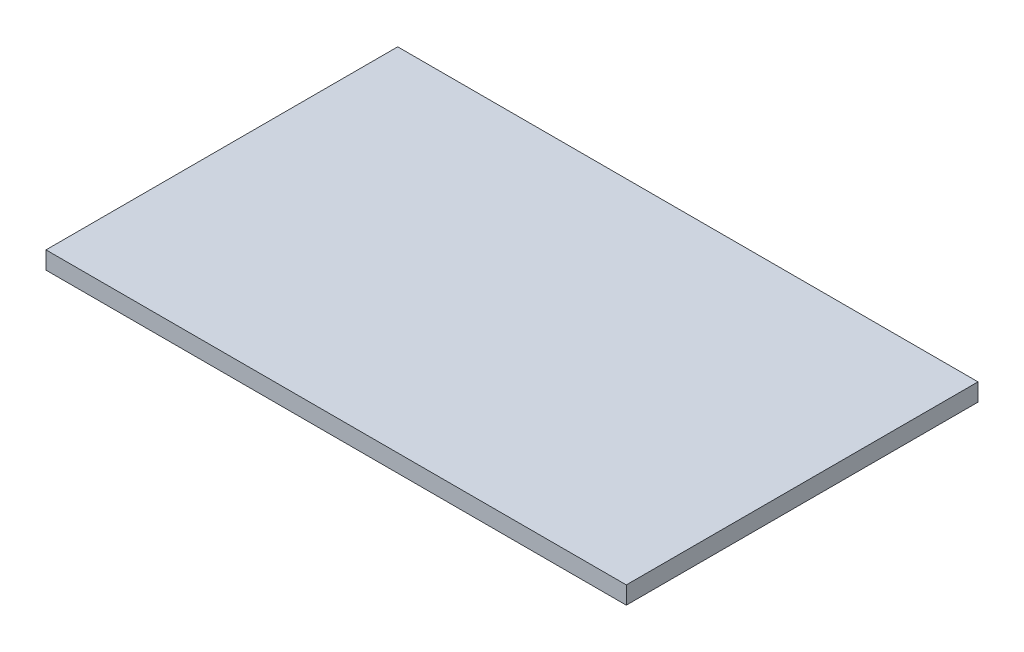
ISO-10303-21;
HEADER;
FILE_DESCRIPTION(('STEP AP214'),'2;1');
FILE_NAME('part.step','',(''),(''),'','','');
FILE_SCHEMA(('AUTOMOTIVE_DESIGN { 1 0 10303 214 1 1 1 1 }'));
ENDSEC;
DATA;
#1=APPLICATION_CONTEXT('core data for automotive mechanical design processes');
#2=APPLICATION_PROTOCOL_DEFINITION('international standard','automotive_design',2000,#1);
#3=PRODUCT_CONTEXT('',#1,'mechanical');
#4=PRODUCT('Part','Part','',(#3));
#5=PRODUCT_RELATED_PRODUCT_CATEGORY('part','',(#4));
#6=PRODUCT_DEFINITION_FORMATION('','',#4);
#7=PRODUCT_DEFINITION_CONTEXT('part definition',#1,'design');
#8=PRODUCT_DEFINITION('design','',#6,#7);
#9=PRODUCT_DEFINITION_SHAPE('','',#8);
#10=(LENGTH_UNIT() NAMED_UNIT(*) SI_UNIT(.MILLI.,.METRE.));
#11=(NAMED_UNIT(*) PLANE_ANGLE_UNIT() SI_UNIT($,.RADIAN.));
#12=(NAMED_UNIT(*) SI_UNIT($,.STERADIAN.) SOLID_ANGLE_UNIT());
#13=UNCERTAINTY_MEASURE_WITH_UNIT(LENGTH_MEASURE(1.E-05),#10,'distance_accuracy_value','');
#14=(GEOMETRIC_REPRESENTATION_CONTEXT(3) GLOBAL_UNCERTAINTY_ASSIGNED_CONTEXT((#13)) GLOBAL_UNIT_ASSIGNED_CONTEXT((#10,
#11,#12)) REPRESENTATION_CONTEXT('',''));
#15=CARTESIAN_POINT('',(0.,0.,0.));
#16=DIRECTION('',(0.,0.,1.));
#17=DIRECTION('',(1.,0.,0.));
#18=AXIS2_PLACEMENT_3D('',#15,#16,#17);
#19=CARTESIAN_POINT('',(-1.65,0.1,1.));
#20=DIRECTION('',(1.,0.,0.));
#21=DIRECTION('',(0.,0.,-1.));
#22=AXIS2_PLACEMENT_3D('',#19,#20,#21);
#23=PLANE('',#22);
#24=DIRECTION('',(0.,0.,1.));
#25=VECTOR('',#24,1.);
#26=CARTESIAN_POINT('',(-1.65,0.,1.));
#27=LINE('',#26,#25);
#28=CARTESIAN_POINT('',(-1.65,0.,-1.));
#29=VERTEX_POINT('',#28);
#30=CARTESIAN_POINT('',(-1.65,0.,1.));
#31=VERTEX_POINT('',#30);
#32=EDGE_CURVE('E98',#29,#31,#27,.T.);
#33=ORIENTED_EDGE('',*,*,#32,.T.);
#34=DIRECTION('',(0.,-1.,0.));
#35=VECTOR('',#34,1.);
#36=CARTESIAN_POINT('',(-1.65,0.1,1.));
#37=LINE('',#36,#35);
#38=CARTESIAN_POINT('',(-1.65,0.1,1.));
#39=VERTEX_POINT('',#38);
#40=EDGE_CURVE('E11',#39,#31,#37,.T.);
#41=ORIENTED_EDGE('',*,*,#40,.F.);
#42=DIRECTION('',(0.,0.,1.));
#43=VECTOR('',#42,1.);
#44=CARTESIAN_POINT('',(-1.65,0.1,1.));
#45=LINE('',#44,#43);
#46=CARTESIAN_POINT('',(-1.65,0.1,-1.));
#47=VERTEX_POINT('',#46);
#48=EDGE_CURVE('E86',#47,#39,#45,.T.);
#49=ORIENTED_EDGE('',*,*,#48,.F.);
#50=DIRECTION('',(0.,-1.,0.));
#51=VECTOR('',#50,1.);
#52=CARTESIAN_POINT('',(-1.65,0.1,-1.));
#53=LINE('',#52,#51);
#54=EDGE_CURVE('E94',#47,#29,#53,.T.);
#55=ORIENTED_EDGE('',*,*,#54,.T.);
#56=EDGE_LOOP('',(#33,#41,#49,#55));
#57=FACE_BOUND('',#56,.T.);
#58=ADVANCED_FACE('F35',(#57),#23,.F.);
#59=CARTESIAN_POINT('',(1.65,0.1,1.));
#60=DIRECTION('',(0.,0.,-1.));
#61=DIRECTION('',(-1.,0.,0.));
#62=AXIS2_PLACEMENT_3D('',#59,#60,#61);
#63=PLANE('',#62);
#64=DIRECTION('',(1.,0.,0.));
#65=VECTOR('',#64,1.);
#66=CARTESIAN_POINT('',(1.65,0.,1.));
#67=LINE('',#66,#65);
#68=CARTESIAN_POINT('',(1.65,0.,1.));
#69=VERTEX_POINT('',#68);
#70=EDGE_CURVE('E90',#31,#69,#67,.T.);
#71=ORIENTED_EDGE('',*,*,#70,.T.);
#72=DIRECTION('',(0.,-1.,0.));
#73=VECTOR('',#72,1.);
#74=CARTESIAN_POINT('',(1.65,0.1,1.));
#75=LINE('',#74,#73);
#76=CARTESIAN_POINT('',(1.65,0.1,1.));
#77=VERTEX_POINT('',#76);
#78=EDGE_CURVE('E43',#77,#69,#75,.T.);
#79=ORIENTED_EDGE('',*,*,#78,.F.);
#80=DIRECTION('',(1.,0.,0.));
#81=VECTOR('',#80,1.);
#82=CARTESIAN_POINT('',(1.65,0.1,1.));
#83=LINE('',#82,#81);
#84=EDGE_CURVE('E81',#39,#77,#83,.T.);
#85=ORIENTED_EDGE('',*,*,#84,.F.);
#86=ORIENTED_EDGE('',*,*,#40,.T.);
#87=EDGE_LOOP('',(#71,#79,#85,#86));
#88=FACE_BOUND('',#87,.T.);
#89=ADVANCED_FACE('F89',(#88),#63,.F.);
#90=CARTESIAN_POINT('',(1.65,0.1,1.));
#91=DIRECTION('',(-1.,0.,0.));
#92=DIRECTION('',(0.,0.,1.));
#93=AXIS2_PLACEMENT_3D('',#90,#91,#92);
#94=PLANE('',#93);
#95=DIRECTION('',(0.,0.,-1.));
#96=VECTOR('',#95,1.);
#97=CARTESIAN_POINT('',(1.65,0.,1.));
#98=LINE('',#97,#96);
#99=CARTESIAN_POINT('',(1.65,0.,-1.));
#100=VERTEX_POINT('',#99);
#101=EDGE_CURVE('E68',#69,#100,#98,.T.);
#102=ORIENTED_EDGE('',*,*,#101,.T.);
#103=DIRECTION('',(0.,-1.,0.));
#104=VECTOR('',#103,1.);
#105=CARTESIAN_POINT('',(1.65,0.1,-1.));
#106=LINE('',#105,#104);
#107=CARTESIAN_POINT('',(1.65,0.1,-1.));
#108=VERTEX_POINT('',#107);
#109=EDGE_CURVE('E91',#108,#100,#106,.T.);
#110=ORIENTED_EDGE('',*,*,#109,.F.);
#111=DIRECTION('',(0.,0.,-1.));
#112=VECTOR('',#111,1.);
#113=CARTESIAN_POINT('',(1.65,0.1,1.));
#114=LINE('',#113,#112);
#115=EDGE_CURVE('E84',#77,#108,#114,.T.);
#116=ORIENTED_EDGE('',*,*,#115,.F.);
#117=ORIENTED_EDGE('',*,*,#78,.T.);
#118=EDGE_LOOP('',(#102,#110,#116,#117));
#119=FACE_BOUND('',#118,.T.);
#120=ADVANCED_FACE('F92',(#119),#94,.F.);
#121=CARTESIAN_POINT('',(1.65,0.1,-1.));
#122=DIRECTION('',(0.,0.,1.));
#123=DIRECTION('',(1.,0.,0.));
#124=AXIS2_PLACEMENT_3D('',#121,#122,#123);
#125=PLANE('',#124);
#126=DIRECTION('',(-1.,0.,0.));
#127=VECTOR('',#126,1.);
#128=CARTESIAN_POINT('',(1.65,0.,-1.));
#129=LINE('',#128,#127);
#130=EDGE_CURVE('E74',#100,#29,#129,.T.);
#131=ORIENTED_EDGE('',*,*,#130,.T.);
#132=ORIENTED_EDGE('',*,*,#54,.F.);
#133=DIRECTION('',(-1.,0.,0.));
#134=VECTOR('',#133,1.);
#135=CARTESIAN_POINT('',(1.65,0.1,-1.));
#136=LINE('',#135,#134);
#137=EDGE_CURVE('E51',#108,#47,#136,.T.);
#138=ORIENTED_EDGE('',*,*,#137,.F.);
#139=ORIENTED_EDGE('',*,*,#109,.T.);
#140=EDGE_LOOP('',(#131,#132,#138,#139));
#141=FACE_BOUND('',#140,.T.);
#142=ADVANCED_FACE('F105',(#141),#125,.F.);
#143=CARTESIAN_POINT('',(0.,0.1,0.));
#144=DIRECTION('',(0.,1.,0.));
#145=DIRECTION('',(0.,0.,1.));
#146=AXIS2_PLACEMENT_3D('',#143,#144,#145);
#147=PLANE('',#146);
#148=ORIENTED_EDGE('',*,*,#48,.T.);
#149=ORIENTED_EDGE('',*,*,#84,.T.);
#150=ORIENTED_EDGE('',*,*,#115,.T.);
#151=ORIENTED_EDGE('',*,*,#137,.T.);
#152=EDGE_LOOP('',(#148,#149,#150,#151));
#153=FACE_BOUND('',#152,.T.);
#154=ADVANCED_FACE('F82',(#153),#147,.T.);
#155=CARTESIAN_POINT('',(0.,0.,0.));
#156=DIRECTION('',(0.,1.,0.));
#157=DIRECTION('',(0.,0.,1.));
#158=AXIS2_PLACEMENT_3D('',#155,#156,#157);
#159=PLANE('',#158);
#160=ORIENTED_EDGE('',*,*,#32,.F.);
#161=ORIENTED_EDGE('',*,*,#130,.F.);
#162=ORIENTED_EDGE('',*,*,#101,.F.);
#163=ORIENTED_EDGE('',*,*,#70,.F.);
#164=EDGE_LOOP('',(#160,#161,#162,#163));
#165=FACE_BOUND('',#164,.T.);
#166=ADVANCED_FACE('F108',(#165),#159,.F.);
#167=CLOSED_SHELL('',(#58,#89,#120,#142,#154,#166));
#168=MANIFOLD_SOLID_BREP('B2',#167);
#169=ADVANCED_BREP_SHAPE_REPRESENTATION('',(#18,#168),#14);
#170=SHAPE_DEFINITION_REPRESENTATION(#9,#169);
ENDSEC;
END-ISO-10303-21;
